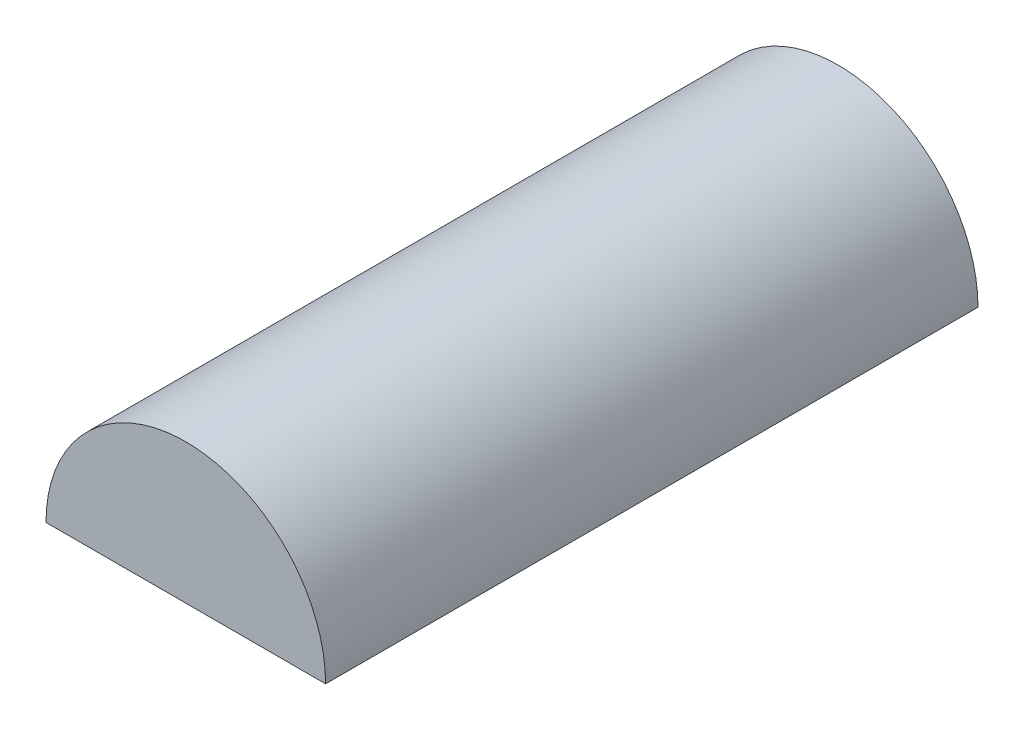
ISO-10303-21;
HEADER;
FILE_DESCRIPTION(('STEP AP214'),'2;1');
FILE_NAME('part.step','',(''),(''),'','','');
FILE_SCHEMA(('AUTOMOTIVE_DESIGN { 1 0 10303 214 1 1 1 1 }'));
ENDSEC;
DATA;
#1=APPLICATION_CONTEXT('core data for automotive mechanical design processes');
#2=APPLICATION_PROTOCOL_DEFINITION('international standard','automotive_design',2000,#1);
#3=PRODUCT_CONTEXT('',#1,'mechanical');
#4=PRODUCT('Part','Part','',(#3));
#5=PRODUCT_RELATED_PRODUCT_CATEGORY('part','',(#4));
#6=PRODUCT_DEFINITION_FORMATION('','',#4);
#7=PRODUCT_DEFINITION_CONTEXT('part definition',#1,'design');
#8=PRODUCT_DEFINITION('design','',#6,#7);
#9=PRODUCT_DEFINITION_SHAPE('','',#8);
#10=(LENGTH_UNIT() NAMED_UNIT(*) SI_UNIT(.MILLI.,.METRE.));
#11=(NAMED_UNIT(*) PLANE_ANGLE_UNIT() SI_UNIT($,.RADIAN.));
#12=(NAMED_UNIT(*) SI_UNIT($,.STERADIAN.) SOLID_ANGLE_UNIT());
#13=UNCERTAINTY_MEASURE_WITH_UNIT(LENGTH_MEASURE(1.E-05),#10,'distance_accuracy_value','');
#14=(GEOMETRIC_REPRESENTATION_CONTEXT(3) GLOBAL_UNCERTAINTY_ASSIGNED_CONTEXT((#13)) GLOBAL_UNIT_ASSIGNED_CONTEXT((#10,
#11,#12)) REPRESENTATION_CONTEXT('',''));
#15=CARTESIAN_POINT('',(0.,0.,0.));
#16=DIRECTION('',(0.,0.,1.));
#17=DIRECTION('',(1.,0.,0.));
#18=AXIS2_PLACEMENT_3D('',#15,#16,#17);
#19=CARTESIAN_POINT('',(0.,-0.25,-0.0333333333385551));
#20=DIRECTION('',(0.,0.,1.));
#21=DIRECTION('',(1.,0.,0.));
#22=AXIS2_PLACEMENT_3D('',#19,#20,#21);
#23=PLANE('',#22);
#24=DIRECTION('',(1.,0.,0.));
#25=VECTOR('',#24,1.);
#26=CARTESIAN_POINT('',(-0.15,-0.25,-0.0333333333385551));
#27=LINE('',#26,#25);
#28=CARTESIAN_POINT('',(0.15,-0.25,-0.0333333333385551));
#29=VERTEX_POINT('',#28);
#30=CARTESIAN_POINT('',(-0.15,-0.25,-0.0333333333385551));
#31=VERTEX_POINT('',#30);
#32=EDGE_CURVE('E43',#29,#31,#27,.F.);
#33=ORIENTED_EDGE('',*,*,#32,.T.);
#34=CARTESIAN_POINT('',(0.,-0.25,-0.0333333333385551));
#35=DIRECTION('',(0.,0.,-1.));
#36=DIRECTION('',(-1.,0.,0.));
#37=AXIS2_PLACEMENT_3D('',#34,#35,#36);
#38=CIRCLE('',#37,0.15);
#39=EDGE_CURVE('E20',#29,#31,#38,.F.);
#40=ORIENTED_EDGE('',*,*,#39,.F.);
#41=EDGE_LOOP('',(#33,#40));
#42=FACE_BOUND('',#41,.T.);
#43=ADVANCED_FACE('F17',(#42),#23,.F.);
#44=CARTESIAN_POINT('',(0.,-0.25,0.666666666666667));
#45=DIRECTION('',(0.,0.,1.));
#46=DIRECTION('',(1.,0.,0.));
#47=AXIS2_PLACEMENT_3D('',#44,#45,#46);
#48=PLANE('',#47);
#49=CARTESIAN_POINT('',(0.,-0.25,0.666666666666667));
#50=DIRECTION('',(0.,0.,-1.));
#51=DIRECTION('',(-1.,0.,0.));
#52=AXIS2_PLACEMENT_3D('',#49,#50,#51);
#53=CIRCLE('',#52,0.15);
#54=CARTESIAN_POINT('',(-0.15,-0.25,0.666666666666667));
#55=VERTEX_POINT('',#54);
#56=CARTESIAN_POINT('',(0.15,-0.25,0.666666666666667));
#57=VERTEX_POINT('',#56);
#58=EDGE_CURVE('E26',#55,#57,#53,.T.);
#59=ORIENTED_EDGE('',*,*,#58,.F.);
#60=DIRECTION('',(1.,0.,0.));
#61=VECTOR('',#60,1.);
#62=CARTESIAN_POINT('',(-0.15,-0.25,0.666666666666667));
#63=LINE('',#62,#61);
#64=EDGE_CURVE('E34',#55,#57,#63,.T.);
#65=ORIENTED_EDGE('',*,*,#64,.T.);
#66=EDGE_LOOP('',(#59,#65));
#67=FACE_BOUND('',#66,.T.);
#68=ADVANCED_FACE('F55',(#67),#48,.T.);
#69=CARTESIAN_POINT('',(-0.15,-0.25,0.666666666666667));
#70=DIRECTION('',(0.,1.,0.));
#71=DIRECTION('',(0.,0.,1.));
#72=AXIS2_PLACEMENT_3D('',#69,#70,#71);
#73=PLANE('',#72);
#74=DIRECTION('',(0.,0.,-1.));
#75=VECTOR('',#74,1.);
#76=CARTESIAN_POINT('',(0.15,-0.25,0.666666666666667));
#77=LINE('',#76,#75);
#78=EDGE_CURVE('E11',#57,#29,#77,.T.);
#79=ORIENTED_EDGE('',*,*,#78,.F.);
#80=ORIENTED_EDGE('',*,*,#64,.F.);
#81=DIRECTION('',(0.,0.,-1.));
#82=VECTOR('',#81,1.);
#83=CARTESIAN_POINT('',(-0.15,-0.25,0.666666666666667));
#84=LINE('',#83,#82);
#85=EDGE_CURVE('E48',#31,#55,#84,.F.);
#86=ORIENTED_EDGE('',*,*,#85,.F.);
#87=ORIENTED_EDGE('',*,*,#32,.F.);
#88=EDGE_LOOP('',(#79,#80,#86,#87));
#89=FACE_BOUND('',#88,.T.);
#90=ADVANCED_FACE('F49',(#89),#73,.F.);
#91=CARTESIAN_POINT('',(0.,-0.25,0.666666666666667));
#92=DIRECTION('',(0.,0.,-1.));
#93=DIRECTION('',(-1.,0.,0.));
#94=AXIS2_PLACEMENT_3D('',#91,#92,#93);
#95=CYLINDRICAL_SURFACE('',#94,0.15);
#96=ORIENTED_EDGE('',*,*,#58,.T.);
#97=ORIENTED_EDGE('',*,*,#78,.T.);
#98=ORIENTED_EDGE('',*,*,#39,.T.);
#99=ORIENTED_EDGE('',*,*,#85,.T.);
#100=EDGE_LOOP('',(#96,#97,#98,#99));
#101=FACE_BOUND('',#100,.T.);
#102=ADVANCED_FACE('F53',(#101),#95,.T.);
#103=CLOSED_SHELL('',(#43,#68,#90,#102));
#104=MANIFOLD_SOLID_BREP('B1',#103);
#105=ADVANCED_BREP_SHAPE_REPRESENTATION('',(#18,#104),#14);
#106=SHAPE_DEFINITION_REPRESENTATION(#9,#105);
ENDSEC;
END-ISO-10303-21;
